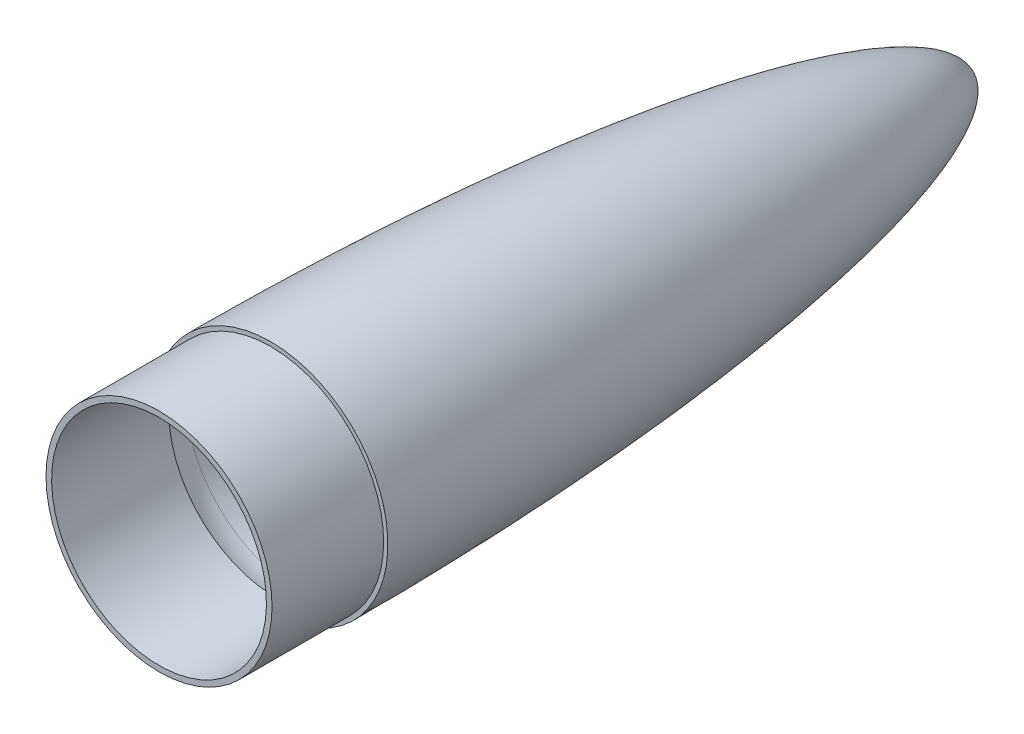
ISO-10303-21;
HEADER;
FILE_DESCRIPTION(('STEP AP214'),'2;1');
FILE_NAME('part.step','',(''),(''),'','','');
FILE_SCHEMA(('AUTOMOTIVE_DESIGN { 1 0 10303 214 1 1 1 1 }'));
ENDSEC;
DATA;
#1=APPLICATION_CONTEXT('core data for automotive mechanical design processes');
#2=APPLICATION_PROTOCOL_DEFINITION('international standard','automotive_design',2000,#1);
#3=PRODUCT_CONTEXT('',#1,'mechanical');
#4=PRODUCT('Part','Part','',(#3));
#5=PRODUCT_RELATED_PRODUCT_CATEGORY('part','',(#4));
#6=PRODUCT_DEFINITION_FORMATION('','',#4);
#7=PRODUCT_DEFINITION_CONTEXT('part definition',#1,'design');
#8=PRODUCT_DEFINITION('design','',#6,#7);
#9=PRODUCT_DEFINITION_SHAPE('','',#8);
#10=(LENGTH_UNIT() NAMED_UNIT(*) SI_UNIT(.MILLI.,.METRE.));
#11=(NAMED_UNIT(*) PLANE_ANGLE_UNIT() SI_UNIT($,.RADIAN.));
#12=(NAMED_UNIT(*) SI_UNIT($,.STERADIAN.) SOLID_ANGLE_UNIT());
#13=UNCERTAINTY_MEASURE_WITH_UNIT(LENGTH_MEASURE(1.E-05),#10,'distance_accuracy_value','');
#14=(GEOMETRIC_REPRESENTATION_CONTEXT(3) GLOBAL_UNCERTAINTY_ASSIGNED_CONTEXT((#13)) GLOBAL_UNIT_ASSIGNED_CONTEXT((#10,
#11,#12)) REPRESENTATION_CONTEXT('',''));
#15=CARTESIAN_POINT('',(0.,0.,0.));
#16=DIRECTION('',(0.,0.,1.));
#17=DIRECTION('',(1.,0.,0.));
#18=AXIS2_PLACEMENT_3D('',#15,#16,#17);
#19=CARTESIAN_POINT('',(0.,20.25,20.));
#20=DIRECTION('',(0.,0.,-1.));
#21=DIRECTION('',(0.,1.,0.));
#22=AXIS2_PLACEMENT_3D('',#19,#20,#21);
#23=PLANE('',#22);
#24=CARTESIAN_POINT('',(0.,0.,20.));
#25=DIRECTION('',(0.,0.,-1.));
#26=DIRECTION('',(0.,1.,0.));
#27=AXIS2_PLACEMENT_3D('',#24,#25,#26);
#28=CIRCLE('',#27,19.25);
#29=CARTESIAN_POINT('',(0.,19.25,20.));
#30=VERTEX_POINT('',#29);
#31=EDGE_CURVE('E140',#30,#30,#28,.F.);
#32=ORIENTED_EDGE('',*,*,#31,.F.);
#33=EDGE_LOOP('',(#32));
#34=FACE_BOUND('',#33,.T.);
#35=CARTESIAN_POINT('',(0.,0.,20.));
#36=DIRECTION('',(0.,0.,1.));
#37=DIRECTION('',(0.,-1.,0.));
#38=AXIS2_PLACEMENT_3D('',#35,#36,#37);
#39=CIRCLE('',#38,20.25);
#40=CARTESIAN_POINT('',(0.,-20.25,20.));
#41=VERTEX_POINT('',#40);
#42=EDGE_CURVE('E84',#41,#41,#39,.T.);
#43=ORIENTED_EDGE('',*,*,#42,.T.);
#44=EDGE_LOOP('',(#43));
#45=FACE_BOUND('',#44,.T.);
#46=ADVANCED_FACE('F33',(#34,#45),#23,.F.);
#47=CARTESIAN_POINT('',(0.,0.,-125.));
#48=CARTESIAN_POINT('',(0.,0.147053094628333,-124.99995467177));
#49=CARTESIAN_POINT('',(0.,0.390937655763295,-124.986441797171));
#50=CARTESIAN_POINT('',(0.,0.747957955730212,-124.933331607048));
#51=CARTESIAN_POINT('',(0.,1.21851148631091,-124.800544320437));
#52=CARTESIAN_POINT('',(0.,1.67458750357345,-124.615457906007));
#53=CARTESIAN_POINT('',(0.,2.18291237699527,-124.339511666637));
#54=CARTESIAN_POINT('',(0.,2.74196318015645,-123.950619266747));
#55=CARTESIAN_POINT('',(0.,3.3732313528009,-123.403719973975));
#56=CARTESIAN_POINT('',(0.,4.11255455279358,-122.61781241498));
#57=CARTESIAN_POINT('',(0.,4.99128417601621,-121.475428583717));
#58=CARTESIAN_POINT('',(0.,6.05771616417495,-119.774974023108));
#59=CARTESIAN_POINT('',(0.,7.38083278161011,-117.1705099836));
#60=CARTESIAN_POINT('',(0.,9.04295328763127,-113.072866231426));
#61=CARTESIAN_POINT('',(0.,10.9343764621507,-107.09614161936));
#62=CARTESIAN_POINT('',(0.,12.8172718824802,-99.4488090972892));
#63=CARTESIAN_POINT('',(0.,14.551777455142,-90.5464980145425));
#64=CARTESIAN_POINT('',(0.,16.0369685484714,-81.0954742253962));
#65=CARTESIAN_POINT('',(0.,17.1055720014843,-72.7933321862721));
#66=CARTESIAN_POINT('',(0.,17.8870226373648,-65.6616162744637));
#67=CARTESIAN_POINT('',(0.,18.5728174726649,-58.5202780001353));
#68=CARTESIAN_POINT('',(0.,19.169593124079,-51.3707639644155));
#69=CARTESIAN_POINT('',(0.,19.6652168868269,-44.2135913543045));
#70=CARTESIAN_POINT('',(0.,20.0690334230751,-37.0505706114505));
#71=CARTESIAN_POINT('',(0.,20.3197454476371,-31.6760079321989));
#72=CARTESIAN_POINT('',(0.,20.4658370321751,-28.0915275984904));
#73=CARTESIAN_POINT('',(0.,20.5738224304545,-25.1050200147083));
#74=CARTESIAN_POINT('',(0.,20.6422770714257,-23.0121592531469));
#75=CARTESIAN_POINT('',(0.,20.6959110269492,-21.2221331980278));
#76=CARTESIAN_POINT('',(0.,20.7455415118168,-19.4246408101271));
#77=CARTESIAN_POINT('',(0.,20.7911867531859,-17.6409272411343));
#78=CARTESIAN_POINT('',(0.,20.8386654355431,-15.5322050646562));
#79=CARTESIAN_POINT('',(0.,20.8850672634614,-13.1672432687601));
#80=CARTESIAN_POINT('',(0.,20.92365988319,-10.7365773858092));
#81=CARTESIAN_POINT('',(0.,20.9544847582209,-8.40920243681731));
#82=CARTESIAN_POINT('',(0.,20.9775748328295,-5.91148330430301));
#83=CARTESIAN_POINT('',(0.,20.9929546428648,-3.70705173301539));
#84=CARTESIAN_POINT('',(0.,20.9987190261601,-1.6490508095001));
#85=CARTESIAN_POINT('',(0.,21.,-0.545304807801882));
#86=CARTESIAN_POINT('',(0.,21.,6.08767312328968E-12));
#87=B_SPLINE_CURVE_WITH_KNOTS('',4,(#47,#48,#49,#50,#51,#52,#53,#54,#55,#56,#57,#58,#59,#60,#61,
#62,#63,#64,#65,#66,#67,#68,#69,#70,#71,#72,#73,#74,#75,#76,#77,#78,#79,#80,#81,#82,#83,#84,#85,
#86),.UNSPECIFIED.,.F.,.F.,(5,1,1,1,1,1,1,1,1,1,1,1,1,1,1,1,1,1,1,1,1,1,1,1,1,1,1,1,1,1,1,1,1,1,
1,1,5),(0.0878774716954318,0.0920039590068778,0.0947469384247727,0.0979929283762793,
0.101599011184577,0.105815678840348,0.110978194363347,0.117104993313653,0.125043618040597,
0.136108020057567,0.151442190424682,0.173467082258838,0.207088935476834,0.260316731062409,
0.327560665806738,0.39480459420612,0.462048524544051,0.529292457867322,0.562914425329669,
0.596536392792015,0.663780326923407,0.731024261244772,0.76464622876424,0.798268196283707,
0.815079179960543,0.831890163637379,0.848701147314215,0.857106639152633,0.865512130991051,
0.882323114604135,0.89913409821722,0.915945081830304,0.932756065443389,0.949567049082541,
0.966378032721694,0.983189016360847,1.),.UNSPECIFIED.);
#88=CARTESIAN_POINT('',(0.,0.,20.));
#89=DIRECTION('',(0.,0.,1.));
#90=AXIS1_PLACEMENT('',#88,#89);
#91=SURFACE_OF_REVOLUTION('',#87,#90);
#92=CARTESIAN_POINT('',(0.,0.,0.));
#93=DIRECTION('',(0.,0.,1.));
#94=DIRECTION('',(0.,-1.,0.));
#95=AXIS2_PLACEMENT_3D('',#92,#93,#94);
#96=CIRCLE('',#95,21.0000000001609);
#97=CARTESIAN_POINT('',(0.,-21.0000000001609,0.));
#98=VERTEX_POINT('',#97);
#99=EDGE_CURVE('E41',#98,#98,#96,.T.);
#100=ORIENTED_EDGE('',*,*,#99,.F.);
#101=EDGE_LOOP('',(#100));
#102=FACE_BOUND('',#101,.T.);
#103=CARTESIAN_POINT('',(0.,0.,-125.));
#104=VERTEX_POINT('',#103);
#105=VERTEX_LOOP('',#104);
#106=FACE_BOUND('',#105,.T.);
#107=ADVANCED_FACE('F64',(#102,#106),#91,.T.);
#108=CARTESIAN_POINT('',(0.,21.0000000001609,0.));
#109=DIRECTION('',(0.,0.,-1.));
#110=DIRECTION('',(0.,1.,0.));
#111=AXIS2_PLACEMENT_3D('',#108,#109,#110);
#112=PLANE('',#111);
#113=CARTESIAN_POINT('',(0.,0.,0.));
#114=DIRECTION('',(0.,0.,1.));
#115=DIRECTION('',(0.,-1.,0.));
#116=AXIS2_PLACEMENT_3D('',#113,#114,#115);
#117=CIRCLE('',#116,20.25);
#118=CARTESIAN_POINT('',(0.,-20.25,0.));
#119=VERTEX_POINT('',#118);
#120=EDGE_CURVE('E90',#119,#119,#117,.T.);
#121=ORIENTED_EDGE('',*,*,#120,.F.);
#122=EDGE_LOOP('',(#121));
#123=FACE_BOUND('',#122,.T.);
#124=ORIENTED_EDGE('',*,*,#99,.T.);
#125=EDGE_LOOP('',(#124));
#126=FACE_BOUND('',#125,.T.);
#127=ADVANCED_FACE('F59',(#123,#126),#112,.F.);
#128=CARTESIAN_POINT('',(0.,0.,20.));
#129=DIRECTION('',(0.,0.,1.));
#130=DIRECTION('',(0.,-1.,0.));
#131=AXIS2_PLACEMENT_3D('',#128,#129,#130);
#132=CYLINDRICAL_SURFACE('',#131,20.25);
#133=ORIENTED_EDGE('',*,*,#42,.F.);
#134=EDGE_LOOP('',(#133));
#135=FACE_BOUND('',#134,.T.);
#136=ORIENTED_EDGE('',*,*,#120,.T.);
#137=EDGE_LOOP('',(#136));
#138=FACE_BOUND('',#137,.T.);
#139=ADVANCED_FACE('F50',(#135,#138),#132,.T.);
#140=CARTESIAN_POINT('',(0.,0.000428095574814786,-124.999999842388));
#141=CARTESIAN_POINT('',(0.,0.147372962261511,-124.999936935935));
#142=CARTESIAN_POINT('',(0.,0.39114965019505,-124.986410256888));
#143=CARTESIAN_POINT('',(0.,0.748060945732566,-124.933302543908));
#144=CARTESIAN_POINT('',(0.,1.21851148631091,-124.800544320437));
#145=CARTESIAN_POINT('',(0.,1.67458750357345,-124.615457906007));
#146=CARTESIAN_POINT('',(0.,2.18291237699527,-124.339511666637));
#147=CARTESIAN_POINT('',(0.,2.74196318015645,-123.950619266747));
#148=CARTESIAN_POINT('',(0.,3.3732313528009,-123.403719973975));
#149=CARTESIAN_POINT('',(0.,4.11255455279358,-122.61781241498));
#150=CARTESIAN_POINT('',(0.,4.99128417601621,-121.475428583717));
#151=CARTESIAN_POINT('',(0.,6.05771616417495,-119.774974023108));
#152=CARTESIAN_POINT('',(0.,7.38083278161011,-117.1705099836));
#153=CARTESIAN_POINT('',(0.,9.04295328763127,-113.072866231426));
#154=CARTESIAN_POINT('',(0.,10.9343764621507,-107.09614161936));
#155=CARTESIAN_POINT('',(0.,12.8172718824802,-99.4488090972892));
#156=CARTESIAN_POINT('',(0.,14.551777455142,-90.5464980145425));
#157=CARTESIAN_POINT('',(0.,16.0369685484714,-81.0954742253962));
#158=CARTESIAN_POINT('',(0.,17.1055720014843,-72.7933321862721));
#159=CARTESIAN_POINT('',(0.,17.8870226373648,-65.6616162744637));
#160=CARTESIAN_POINT('',(0.,18.5728174726649,-58.5202780001353));
#161=CARTESIAN_POINT('',(0.,19.169593124079,-51.3707639644155));
#162=CARTESIAN_POINT('',(0.,19.6652168868269,-44.2135913543045));
#163=CARTESIAN_POINT('',(0.,20.0690334230751,-37.0505706114505));
#164=CARTESIAN_POINT('',(0.,20.3197454476371,-31.6760079321989));
#165=CARTESIAN_POINT('',(0.,20.4658370321751,-28.0915275984904));
#166=CARTESIAN_POINT('',(0.,20.5738224304545,-25.1050200147083));
#167=CARTESIAN_POINT('',(0.,20.6422770714257,-23.0121592531469));
#168=CARTESIAN_POINT('',(0.,20.6959110269492,-21.2221331980278));
#169=CARTESIAN_POINT('',(0.,20.7455415118168,-19.4246408101271));
#170=CARTESIAN_POINT('',(0.,20.7911867531859,-17.6409272411343));
#171=CARTESIAN_POINT('',(0.,20.8386654355431,-15.5322050646562));
#172=CARTESIAN_POINT('',(0.,20.8850672634614,-13.1672432687601));
#173=CARTESIAN_POINT('',(0.,20.92365988319,-10.7365773858092));
#174=CARTESIAN_POINT('',(0.,20.9544847582209,-8.40920243681731));
#175=CARTESIAN_POINT('',(0.,20.9775748328295,-5.91148330430301));
#176=CARTESIAN_POINT('',(0.,20.9929546428648,-3.70705173301539));
#177=CARTESIAN_POINT('',(0.,20.9987190261601,-1.6490508095001));
#178=CARTESIAN_POINT('',(0.,21.,-0.545304807801882));
#179=CARTESIAN_POINT('',(0.,21.,6.08767312328968E-12));
#180=B_SPLINE_CURVE_WITH_KNOTS('',4,(#140,#141,#142,#143,#144,#145,#146,#147,#148,#149,#150,
#151,#152,#153,#154,#155,#156,#157,#158,#159,#160,#161,#162,#163,#164,#165,#166,#167,#168,#169,
#170,#171,#172,#173,#174,#175,#176,#177,#178,#179),.UNSPECIFIED.,.F.,.F.,(5,1,1,1,1,1,1,1,1,1,1,
1,1,1,1,1,1,1,1,1,1,1,1,1,1,1,1,1,1,1,1,1,1,1,1,1,5),(0.0878804749273543,0.0920039590068778,
0.0947469384247727,0.0979929283762793,0.101599011184577,0.105815678840348,0.110978194363347,
0.117104993313653,0.125043618040597,0.136108020057567,0.151442190424682,0.173467082258838,
0.207088935476834,0.260316731062409,0.327560665806738,0.39480459420612,0.462048524544051,
0.529292457867322,0.562914425329669,0.596536392792015,0.663780326923407,0.731024261244772,
0.76464622876424,0.798268196283707,0.815079179960543,0.831890163637379,0.848701147314215,
0.857106639152633,0.865512130991051,0.882323114604135,0.89913409821722,0.915945081830304,
0.932756065443389,0.949567049082541,0.966378032721694,0.983189016360847,1.),.UNSPECIFIED.);
#181=CARTESIAN_POINT('',(0.,0.,20.));
#182=DIRECTION('',(0.,0.,1.));
#183=AXIS1_PLACEMENT('',#181,#182);
#184=SURFACE_OF_REVOLUTION('',#180,#183);
#185=OFFSET_SURFACE('',#184,-1.,.F.);
#186=CARTESIAN_POINT('',(0.,0.,-4.82822908745376));
#187=DIRECTION('',(0.,0.,1.));
#188=DIRECTION('',(0.,-1.,0.));
#189=AXIS2_PLACEMENT_3D('',#186,#187,#188);
#190=CIRCLE('',#189,19.9844085157804);
#191=CARTESIAN_POINT('',(0.,-19.9844085157804,-4.82822908745376));
#192=VERTEX_POINT('',#191);
#193=EDGE_CURVE('E11',#192,#192,#190,.T.);
#194=ORIENTED_EDGE('',*,*,#193,.T.);
#195=EDGE_LOOP('',(#194));
#196=FACE_BOUND('',#195,.T.);
#197=CARTESIAN_POINT('',(0.,0.,-123.999999934021));
#198=VERTEX_POINT('',#197);
#199=VERTEX_LOOP('',#198);
#200=FACE_BOUND('',#199,.T.);
#201=ADVANCED_FACE('F47',(#196,#200),#185,.F.);
#202=CARTESIAN_POINT('',(0.,0.,20.));
#203=DIRECTION('',(0.,0.,1.));
#204=DIRECTION('',(0.,-1.,0.));
#205=AXIS2_PLACEMENT_3D('',#202,#203,#204);
#206=CYLINDRICAL_SURFACE('',#205,19.25);
#207=ORIENTED_EDGE('',*,*,#31,.T.);
#208=EDGE_LOOP('',(#207));
#209=FACE_BOUND('',#208,.T.);
#210=CARTESIAN_POINT('',(0.,0.,-1.));
#211=DIRECTION('',(0.,0.,-1.));
#212=DIRECTION('',(0.,1.,0.));
#213=AXIS2_PLACEMENT_3D('',#210,#211,#212);
#214=CIRCLE('',#213,19.25);
#215=CARTESIAN_POINT('',(0.,19.25,-1.));
#216=VERTEX_POINT('',#215);
#217=EDGE_CURVE('E91',#216,#216,#214,.F.);
#218=ORIENTED_EDGE('',*,*,#217,.F.);
#219=EDGE_LOOP('',(#218));
#220=FACE_BOUND('',#219,.T.);
#221=ADVANCED_FACE('F49',(#209,#220),#206,.F.);
#222=CARTESIAN_POINT('',(0.,0.,-4.76203068016712));
#223=DIRECTION('',(0.,0.,1.));
#224=DIRECTION('',(0.,-1.,0.));
#225=AXIS2_PLACEMENT_3D('',#222,#223,#224);
#226=DEGENERATE_TOROIDAL_SURFACE('',#225,9.98462762963731,10.,.T.);
#227=ORIENTED_EDGE('',*,*,#217,.T.);
#228=EDGE_LOOP('',(#227));
#229=FACE_BOUND('',#228,.T.);
#230=ORIENTED_EDGE('',*,*,#193,.F.);
#231=EDGE_LOOP('',(#230));
#232=FACE_BOUND('',#231,.T.);
#233=ADVANCED_FACE('F35',(#229,#232),#226,.F.);
#234=CLOSED_SHELL('',(#46,#107,#127,#139,#201,#221,#233));
#235=MANIFOLD_SOLID_BREP('B2',#234);
#236=ADVANCED_BREP_SHAPE_REPRESENTATION('',(#18,#235),#14);
#237=SHAPE_DEFINITION_REPRESENTATION(#9,#236);
ENDSEC;
END-ISO-10303-21;
